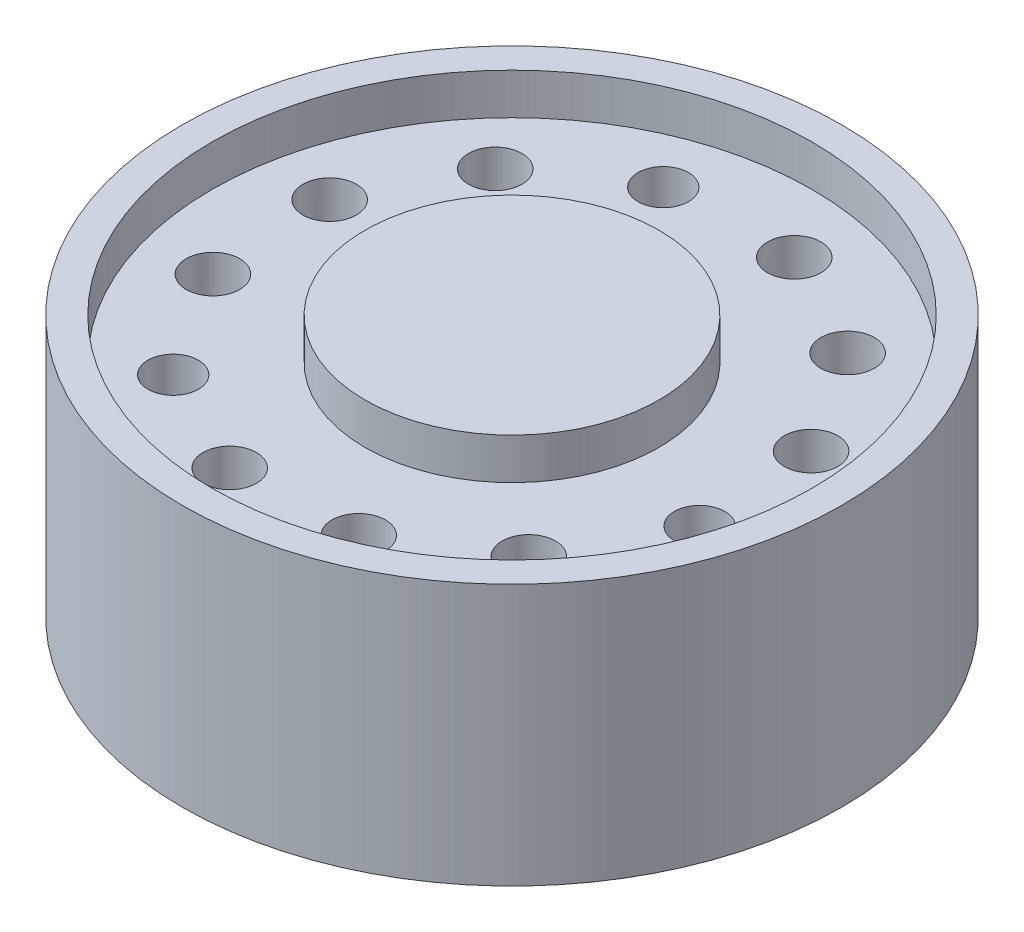
ISO-10303-21;
HEADER;
FILE_DESCRIPTION(('STEP AP214'),'2;1');
FILE_NAME('part.step','',(''),(''),'','','');
FILE_SCHEMA(('AUTOMOTIVE_DESIGN { 1 0 10303 214 1 1 1 1 }'));
ENDSEC;
DATA;
#1=APPLICATION_CONTEXT('core data for automotive mechanical design processes');
#2=APPLICATION_PROTOCOL_DEFINITION('international standard','automotive_design',2000,#1);
#3=PRODUCT_CONTEXT('',#1,'mechanical');
#4=PRODUCT('Part','Part','',(#3));
#5=PRODUCT_RELATED_PRODUCT_CATEGORY('part','',(#4));
#6=PRODUCT_DEFINITION_FORMATION('','',#4);
#7=PRODUCT_DEFINITION_CONTEXT('part definition',#1,'design');
#8=PRODUCT_DEFINITION('design','',#6,#7);
#9=PRODUCT_DEFINITION_SHAPE('','',#8);
#10=(LENGTH_UNIT() NAMED_UNIT(*) SI_UNIT(.MILLI.,.METRE.));
#11=(NAMED_UNIT(*) PLANE_ANGLE_UNIT() SI_UNIT($,.RADIAN.));
#12=(NAMED_UNIT(*) SI_UNIT($,.STERADIAN.) SOLID_ANGLE_UNIT());
#13=UNCERTAINTY_MEASURE_WITH_UNIT(LENGTH_MEASURE(1.E-05),#10,'distance_accuracy_value','');
#14=(GEOMETRIC_REPRESENTATION_CONTEXT(3) GLOBAL_UNCERTAINTY_ASSIGNED_CONTEXT((#13)) GLOBAL_UNIT_ASSIGNED_CONTEXT((#10,
#11,#12)) REPRESENTATION_CONTEXT('',''));
#15=CARTESIAN_POINT('',(0.,0.,0.));
#16=DIRECTION('',(0.,0.,1.));
#17=DIRECTION('',(1.,0.,0.));
#18=AXIS2_PLACEMENT_3D('',#15,#16,#17);
#19=CARTESIAN_POINT('',(0.,0.,0.));
#20=DIRECTION('',(0.,1.,0.));
#21=DIRECTION('',(0.,0.,1.));
#22=AXIS2_PLACEMENT_3D('',#19,#20,#21);
#23=PLANE('',#22);
#24=CARTESIAN_POINT('',(-12.8492820139193,0.,-38.3127139697356));
#25=DIRECTION('',(0.,-1.,0.));
#26=DIRECTION('',(0.,0.,-1.));
#27=AXIS2_PLACEMENT_3D('',#24,#25,#26);
#28=CIRCLE('',#27,4.24999999999999);
#29=CARTESIAN_POINT('',(-12.8492820139193,0.,-42.5627139697355));
#30=VERTEX_POINT('',#29);
#31=EDGE_CURVE('E665',#30,#30,#28,.T.);
#32=ORIENTED_EDGE('',*,*,#31,.F.);
#33=EDGE_LOOP('',(#32));
#34=FACE_BOUND('',#33,.T.);
#35=CARTESIAN_POINT('',(-8.40999001984254,0.,39.1059083498408));
#36=DIRECTION('',(0.,-1.,0.));
#37=DIRECTION('',(0.,0.,-1.));
#38=AXIS2_PLACEMENT_3D('',#35,#36,#37);
#39=CIRCLE('',#38,9.);
#40=CARTESIAN_POINT('',(-8.40999001984254,0.,30.1059083498408));
#41=VERTEX_POINT('',#40);
#42=EDGE_CURVE('E124',#41,#41,#39,.T.);
#43=ORIENTED_EDGE('',*,*,#42,.F.);
#44=EDGE_LOOP('',(#43));
#45=FACE_BOUND('',#44,.T.);
#46=CARTESIAN_POINT('',(29.6617150591073,0.,26.8362191776771));
#47=DIRECTION('',(0.,-1.,0.));
#48=DIRECTION('',(0.,0.,-1.));
#49=AXIS2_PLACEMENT_3D('',#46,#47,#48);
#50=CIRCLE('',#49,9.);
#51=CARTESIAN_POINT('',(29.6617150591073,0.,17.8362191776771));
#52=VERTEX_POINT('',#51);
#53=EDGE_CURVE('E137',#52,#52,#50,.T.);
#54=ORIENTED_EDGE('',*,*,#53,.F.);
#55=EDGE_LOOP('',(#54));
#56=FACE_BOUND('',#55,.T.);
#57=CARTESIAN_POINT('',(38.0717050789492,0.,-12.2696891721639));
#58=DIRECTION('',(0.,-1.,0.));
#59=DIRECTION('',(0.,0.,-1.));
#60=AXIS2_PLACEMENT_3D('',#57,#58,#59);
#61=CIRCLE('',#60,9.);
#62=CARTESIAN_POINT('',(38.0717050789492,0.,-21.2696891721639));
#63=VERTEX_POINT('',#62);
#64=EDGE_CURVE('E160',#63,#63,#61,.T.);
#65=ORIENTED_EDGE('',*,*,#64,.F.);
#66=EDGE_LOOP('',(#65));
#67=FACE_BOUND('',#66,.T.);
#68=CARTESIAN_POINT('',(26.8362191776771,0.,-29.6617150591074));
#69=DIRECTION('',(0.,-1.,0.));
#70=DIRECTION('',(0.,0.,-1.));
#71=AXIS2_PLACEMENT_3D('',#68,#69,#70);
#72=CIRCLE('',#71,9.);
#73=CARTESIAN_POINT('',(26.8362191776771,0.,-38.6617150591074));
#74=VERTEX_POINT('',#73);
#75=EDGE_CURVE('E169',#74,#74,#72,.T.);
#76=ORIENTED_EDGE('',*,*,#75,.F.);
#77=EDGE_LOOP('',(#76));
#78=FACE_BOUND('',#77,.T.);
#79=CARTESIAN_POINT('',(8.40999001984173,0.,-39.105908349841));
#80=DIRECTION('',(0.,-1.,0.));
#81=DIRECTION('',(0.,0.,-1.));
#82=AXIS2_PLACEMENT_3D('',#79,#80,#81);
#83=CIRCLE('',#82,9.);
#84=CARTESIAN_POINT('',(8.40999001984173,0.,-48.105908349841));
#85=VERTEX_POINT('',#84);
#86=EDGE_CURVE('E185',#85,#85,#83,.T.);
#87=ORIENTED_EDGE('',*,*,#86,.F.);
#88=EDGE_LOOP('',(#87));
#89=FACE_BOUND('',#88,.T.);
#90=CARTESIAN_POINT('',(-29.6617150591071,0.,-26.8362191776774));
#91=DIRECTION('',(0.,-1.,0.));
#92=DIRECTION('',(0.,0.,-1.));
#93=AXIS2_PLACEMENT_3D('',#90,#91,#92);
#94=CIRCLE('',#93,9.);
#95=CARTESIAN_POINT('',(-29.6617150591071,0.,-35.8362191776774));
#96=VERTEX_POINT('',#95);
#97=EDGE_CURVE('E199',#96,#96,#94,.T.);
#98=ORIENTED_EDGE('',*,*,#97,.F.);
#99=EDGE_LOOP('',(#98));
#100=FACE_BOUND('',#99,.T.);
#101=CARTESIAN_POINT('',(-39.1059083498409,0.,-8.40999001984212));
#102=DIRECTION('',(0.,-1.,0.));
#103=DIRECTION('',(0.,0.,-1.));
#104=AXIS2_PLACEMENT_3D('',#101,#102,#103);
#105=CIRCLE('',#104,9.);
#106=CARTESIAN_POINT('',(-39.1059083498409,0.,-17.4099900198421));
#107=VERTEX_POINT('',#106);
#108=EDGE_CURVE('E244',#107,#107,#105,.T.);
#109=ORIENTED_EDGE('',*,*,#108,.F.);
#110=EDGE_LOOP('',(#109));
#111=FACE_BOUND('',#110,.T.);
#112=CARTESIAN_POINT('',(-38.0717050789493,0.,12.2696891721636));
#113=DIRECTION('',(0.,-1.,0.));
#114=DIRECTION('',(0.,0.,-1.));
#115=AXIS2_PLACEMENT_3D('',#112,#113,#114);
#116=CIRCLE('',#115,9.);
#117=CARTESIAN_POINT('',(-38.0717050789493,0.,3.26968917216361));
#118=VERTEX_POINT('',#117);
#119=EDGE_CURVE('E248',#118,#118,#116,.T.);
#120=ORIENTED_EDGE('',*,*,#119,.F.);
#121=EDGE_LOOP('',(#120));
#122=FACE_BOUND('',#121,.T.);
#123=CARTESIAN_POINT('',(0.,0.,0.));
#124=DIRECTION('',(0.,1.,0.));
#125=DIRECTION('',(0.,0.,1.));
#126=AXIS2_PLACEMENT_3D('',#123,#124,#125);
#127=CIRCLE('',#126,55.5);
#128=CARTESIAN_POINT('',(0.,0.,55.5));
#129=VERTEX_POINT('',#128);
#130=EDGE_CURVE('E43',#129,#129,#127,.T.);
#131=ORIENTED_EDGE('',*,*,#130,.F.);
#132=EDGE_LOOP('',(#131));
#133=FACE_BOUND('',#132,.T.);
#134=CARTESIAN_POINT('',(12.2696891721637,0.,38.0717050789492));
#135=DIRECTION('',(0.,-1.,0.));
#136=DIRECTION('',(0.,0.,-1.));
#137=AXIS2_PLACEMENT_3D('',#134,#135,#136);
#138=CIRCLE('',#137,9.);
#139=CARTESIAN_POINT('',(12.2696891721637,0.,29.0717050789492));
#140=VERTEX_POINT('',#139);
#141=EDGE_CURVE('E99',#140,#140,#138,.T.);
#142=ORIENTED_EDGE('',*,*,#141,.F.);
#143=EDGE_LOOP('',(#142));
#144=FACE_BOUND('',#143,.T.);
#145=CARTESIAN_POINT('',(39.6044245926776,0.,8.02855234042326));
#146=DIRECTION('',(0.,-1.,0.));
#147=DIRECTION('',(0.,0.,-1.));
#148=AXIS2_PLACEMENT_3D('',#145,#146,#147);
#149=CIRCLE('',#148,4.24999999999999);
#150=CARTESIAN_POINT('',(39.6044245926776,0.,3.77855234042327));
#151=VERTEX_POINT('',#150);
#152=EDGE_CURVE('E87',#151,#151,#149,.T.);
#153=ORIENTED_EDGE('',*,*,#152,.F.);
#154=EDGE_LOOP('',(#153));
#155=FACE_BOUND('',#154,.T.);
#156=CARTESIAN_POINT('',(-26.7551425787583,0.,30.2841616293123));
#157=DIRECTION('',(0.,-1.,0.));
#158=DIRECTION('',(0.,0.,-1.));
#159=AXIS2_PLACEMENT_3D('',#156,#157,#158);
#160=CIRCLE('',#159,4.24999999999999);
#161=CARTESIAN_POINT('',(-26.7551425787583,0.,26.0341616293123));
#162=VERTEX_POINT('',#161);
#163=EDGE_CURVE('E88',#162,#162,#160,.T.);
#164=ORIENTED_EDGE('',*,*,#163,.F.);
#165=EDGE_LOOP('',(#164));
#166=FACE_BOUND('',#165,.T.);
#167=ADVANCED_FACE('F39',(#34,#45,#56,#67,#78,#89,#100,#111,#122,#133,#144,#155,#166),#23,.F.);
#168=CARTESIAN_POINT('',(0.,44.,0.));
#169=DIRECTION('',(0.,-1.,0.));
#170=DIRECTION('',(0.,0.,-1.));
#171=AXIS2_PLACEMENT_3D('',#168,#169,#170);
#172=CYLINDRICAL_SURFACE('',#171,55.5);
#173=CARTESIAN_POINT('',(0.,44.,0.));
#174=DIRECTION('',(0.,1.,0.));
#175=DIRECTION('',(0.,0.,1.));
#176=AXIS2_PLACEMENT_3D('',#173,#174,#175);
#177=CIRCLE('',#176,55.5);
#178=CARTESIAN_POINT('',(0.,44.,55.5));
#179=VERTEX_POINT('',#178);
#180=EDGE_CURVE('E11',#179,#179,#177,.T.);
#181=ORIENTED_EDGE('',*,*,#180,.F.);
#182=EDGE_LOOP('',(#181));
#183=FACE_BOUND('',#182,.T.);
#184=ORIENTED_EDGE('',*,*,#130,.T.);
#185=EDGE_LOOP('',(#184));
#186=FACE_BOUND('',#185,.T.);
#187=ADVANCED_FACE('F41',(#183,#186),#172,.T.);
#188=CARTESIAN_POINT('',(0.,44.,0.));
#189=DIRECTION('',(0.,1.,0.));
#190=DIRECTION('',(0.,0.,1.));
#191=AXIS2_PLACEMENT_3D('',#188,#189,#190);
#192=PLANE('',#191);
#193=CARTESIAN_POINT('',(0.,44.,0.));
#194=DIRECTION('',(0.,1.,0.));
#195=DIRECTION('',(0.,0.,1.));
#196=AXIS2_PLACEMENT_3D('',#193,#194,#195);
#197=CIRCLE('',#196,50.5);
#198=CARTESIAN_POINT('',(0.,44.,50.5));
#199=VERTEX_POINT('',#198);
#200=EDGE_CURVE('E54',#199,#199,#197,.T.);
#201=ORIENTED_EDGE('',*,*,#200,.F.);
#202=EDGE_LOOP('',(#201));
#203=FACE_BOUND('',#202,.T.);
#204=ORIENTED_EDGE('',*,*,#180,.T.);
#205=EDGE_LOOP('',(#204));
#206=FACE_BOUND('',#205,.T.);
#207=ADVANCED_FACE('F384',(#203,#206),#192,.T.);
#208=CARTESIAN_POINT('',(0.,37.07,0.));
#209=DIRECTION('',(0.,1.,0.));
#210=DIRECTION('',(0.,0.,1.));
#211=AXIS2_PLACEMENT_3D('',#208,#209,#210);
#212=CYLINDRICAL_SURFACE('',#211,24.75);
#213=CARTESIAN_POINT('',(0.,37.07,0.));
#214=DIRECTION('',(0.,1.,0.));
#215=DIRECTION('',(0.,0.,1.));
#216=AXIS2_PLACEMENT_3D('',#213,#214,#215);
#217=CIRCLE('',#216,24.75);
#218=CARTESIAN_POINT('',(0.,37.07,24.75));
#219=VERTEX_POINT('',#218);
#220=EDGE_CURVE('E66',#219,#219,#217,.T.);
#221=CARTESIAN_POINT('',(0.,44.,0.));
#222=DIRECTION('',(0.,1.,0.));
#223=DIRECTION('',(0.,0.,1.));
#224=AXIS2_PLACEMENT_3D('',#221,#222,#223);
#225=CIRCLE('',#224,24.75);
#226=CARTESIAN_POINT('',(0.,44.,24.75));
#227=VERTEX_POINT('',#226);
#228=EDGE_CURVE('E76',#227,#227,#225,.T.);
#229=CARTESIAN_POINT('',(0.,37.07,24.75));
#230=CARTESIAN_POINT('',(0.,37.1421875,24.75));
#231=CARTESIAN_POINT('',(0.,37.214375,24.75));
#232=CARTESIAN_POINT('',(0.,37.35875,24.75));
#233=CARTESIAN_POINT('',(0.,37.4309375,24.75));
#234=CARTESIAN_POINT('',(0.,37.5753125,24.75));
#235=CARTESIAN_POINT('',(0.,37.6475,24.75));
#236=CARTESIAN_POINT('',(0.,37.791875,24.75));
#237=CARTESIAN_POINT('',(0.,37.8640625,24.75));
#238=CARTESIAN_POINT('',(0.,38.0084375,24.75));
#239=CARTESIAN_POINT('',(0.,38.080625,24.75));
#240=CARTESIAN_POINT('',(0.,38.225,24.75));
#241=CARTESIAN_POINT('',(0.,38.2971875,24.75));
#242=CARTESIAN_POINT('',(0.,38.4415625,24.75));
#243=CARTESIAN_POINT('',(0.,38.51375,24.75));
#244=CARTESIAN_POINT('',(0.,38.658125,24.75));
#245=CARTESIAN_POINT('',(0.,38.7303125,24.75));
#246=CARTESIAN_POINT('',(0.,38.8746875,24.75));
#247=CARTESIAN_POINT('',(0.,38.946875,24.75));
#248=CARTESIAN_POINT('',(0.,39.09125,24.75));
#249=CARTESIAN_POINT('',(0.,39.1634375,24.75));
#250=CARTESIAN_POINT('',(0.,39.3078125,24.75));
#251=CARTESIAN_POINT('',(0.,39.38,24.75));
#252=CARTESIAN_POINT('',(0.,39.524375,24.75));
#253=CARTESIAN_POINT('',(0.,39.5965625,24.75));
#254=CARTESIAN_POINT('',(0.,39.7409375,24.75));
#255=CARTESIAN_POINT('',(0.,39.813125,24.75));
#256=CARTESIAN_POINT('',(0.,39.9575,24.75));
#257=CARTESIAN_POINT('',(0.,40.0296875,24.75));
#258=CARTESIAN_POINT('',(0.,40.1740625,24.75));
#259=CARTESIAN_POINT('',(0.,40.24625,24.75));
#260=CARTESIAN_POINT('',(0.,40.390625,24.75));
#261=CARTESIAN_POINT('',(0.,40.4628125,24.75));
#262=CARTESIAN_POINT('',(0.,40.6071875,24.75));
#263=CARTESIAN_POINT('',(0.,40.679375,24.75));
#264=CARTESIAN_POINT('',(0.,40.82375,24.75));
#265=CARTESIAN_POINT('',(0.,40.8959375,24.75));
#266=CARTESIAN_POINT('',(0.,41.0403125,24.75));
#267=CARTESIAN_POINT('',(0.,41.1125,24.75));
#268=CARTESIAN_POINT('',(0.,41.256875,24.75));
#269=CARTESIAN_POINT('',(0.,41.3290625,24.75));
#270=CARTESIAN_POINT('',(0.,41.4734375,24.75));
#271=CARTESIAN_POINT('',(0.,41.545625,24.75));
#272=CARTESIAN_POINT('',(0.,41.69,24.75));
#273=CARTESIAN_POINT('',(0.,41.7621875,24.75));
#274=CARTESIAN_POINT('',(0.,41.9065625,24.75));
#275=CARTESIAN_POINT('',(0.,41.97875,24.75));
#276=CARTESIAN_POINT('',(0.,42.123125,24.75));
#277=CARTESIAN_POINT('',(0.,42.1953125,24.75));
#278=CARTESIAN_POINT('',(0.,42.3396875,24.75));
#279=CARTESIAN_POINT('',(0.,42.411875,24.75));
#280=CARTESIAN_POINT('',(0.,42.55625,24.75));
#281=CARTESIAN_POINT('',(0.,42.6284375,24.75));
#282=CARTESIAN_POINT('',(0.,42.7728125,24.75));
#283=CARTESIAN_POINT('',(0.,42.845,24.75));
#284=CARTESIAN_POINT('',(0.,42.989375,24.75));
#285=CARTESIAN_POINT('',(0.,43.0615625,24.75));
#286=CARTESIAN_POINT('',(0.,43.2059375,24.75));
#287=CARTESIAN_POINT('',(0.,43.278125,24.75));
#288=CARTESIAN_POINT('',(0.,43.4225,24.75));
#289=CARTESIAN_POINT('',(0.,43.4946875,24.75));
#290=CARTESIAN_POINT('',(0.,43.6390625,24.75));
#291=CARTESIAN_POINT('',(0.,43.71125,24.75));
#292=CARTESIAN_POINT('',(0.,43.855625,24.75));
#293=CARTESIAN_POINT('',(0.,43.9278125,24.75));
#294=CARTESIAN_POINT('',(0.,44.,24.75));
#295=B_SPLINE_CURVE_WITH_KNOTS('',3,(#229,#230,#231,#232,#233,#234,#235,#236,#237,#238,#239,
#240,#241,#242,#243,#244,#245,#246,#247,#248,#249,#250,#251,#252,#253,#254,#255,#256,#257,#258,
#259,#260,#261,#262,#263,#264,#265,#266,#267,#268,#269,#270,#271,#272,#273,#274,#275,#276,#277,
#278,#279,#280,#281,#282,#283,#284,#285,#286,#287,#288,#289,#290,#291,#292,#293,#294),
.UNSPECIFIED.,.F.,.F.,(4,2,2,2,2,2,2,2,2,2,2,2,2,2,2,2,2,2,2,2,2,2,2,2,2,2,2,2,2,2,2,2,4),(0.,
0.216562499999996,0.433124999999999,0.649687499999996,0.866249999999999,1.0828125,1.299375,
1.51593749999999,1.7325,1.94906249999999,2.165625,2.38218749999999,2.59875,2.81531249999999,
3.031875,3.24843749999999,3.465,3.68156249999999,3.898125,4.1146875,4.33124999999999,
4.54781249999999,4.76437499999999,4.9809375,5.19749999999999,5.4140625,5.63062499999999,
5.8471875,6.06374999999999,6.2803125,6.49687499999999,6.7134375,6.92999999999999),.UNSPECIFIED.);
#296=EDGE_CURVE('BSEAM310',#219,#227,#295,.T.);
#297=ORIENTED_EDGE('',*,*,#220,.T.);
#298=ORIENTED_EDGE('',*,*,#228,.F.);
#299=ORIENTED_EDGE('',*,*,#296,.T.);
#300=ORIENTED_EDGE('',*,*,#296,.F.);
#301=EDGE_LOOP('',(#297,#299,#298,#300));
#302=FACE_BOUND('',#301,.T.);
#303=ADVANCED_FACE('F310',(#302),#212,.T.);
#304=CARTESIAN_POINT('',(0.,37.07,0.));
#305=DIRECTION('',(0.,1.,0.));
#306=DIRECTION('',(0.,0.,1.));
#307=AXIS2_PLACEMENT_3D('',#304,#305,#306);
#308=CYLINDRICAL_SURFACE('',#307,50.5);
#309=CARTESIAN_POINT('',(0.,37.07,0.));
#310=DIRECTION('',(0.,1.,0.));
#311=DIRECTION('',(0.,0.,1.));
#312=AXIS2_PLACEMENT_3D('',#309,#310,#311);
#313=CIRCLE('',#312,50.5);
#314=CARTESIAN_POINT('',(0.,37.07,50.5));
#315=VERTEX_POINT('',#314);
#316=EDGE_CURVE('E51',#315,#315,#313,.T.);
#317=CARTESIAN_POINT('',(0.,37.07,50.5));
#318=CARTESIAN_POINT('',(0.,37.1421875,50.5));
#319=CARTESIAN_POINT('',(0.,37.214375,50.5));
#320=CARTESIAN_POINT('',(0.,37.35875,50.5));
#321=CARTESIAN_POINT('',(0.,37.4309375,50.5));
#322=CARTESIAN_POINT('',(0.,37.5753125,50.5));
#323=CARTESIAN_POINT('',(0.,37.6475,50.5));
#324=CARTESIAN_POINT('',(0.,37.791875,50.5));
#325=CARTESIAN_POINT('',(0.,37.8640625,50.5));
#326=CARTESIAN_POINT('',(0.,38.0084375,50.5));
#327=CARTESIAN_POINT('',(0.,38.080625,50.5));
#328=CARTESIAN_POINT('',(0.,38.225,50.5));
#329=CARTESIAN_POINT('',(0.,38.2971875,50.5));
#330=CARTESIAN_POINT('',(0.,38.4415625,50.5));
#331=CARTESIAN_POINT('',(0.,38.51375,50.5));
#332=CARTESIAN_POINT('',(0.,38.658125,50.5));
#333=CARTESIAN_POINT('',(0.,38.7303125,50.5));
#334=CARTESIAN_POINT('',(0.,38.8746875,50.5));
#335=CARTESIAN_POINT('',(0.,38.946875,50.5));
#336=CARTESIAN_POINT('',(0.,39.09125,50.5));
#337=CARTESIAN_POINT('',(0.,39.1634375,50.5));
#338=CARTESIAN_POINT('',(0.,39.3078125,50.5));
#339=CARTESIAN_POINT('',(0.,39.38,50.5));
#340=CARTESIAN_POINT('',(0.,39.524375,50.5));
#341=CARTESIAN_POINT('',(0.,39.5965625,50.5));
#342=CARTESIAN_POINT('',(0.,39.7409375,50.5));
#343=CARTESIAN_POINT('',(0.,39.813125,50.5));
#344=CARTESIAN_POINT('',(0.,39.9575,50.5));
#345=CARTESIAN_POINT('',(0.,40.0296875,50.5));
#346=CARTESIAN_POINT('',(0.,40.1740625,50.5));
#347=CARTESIAN_POINT('',(0.,40.24625,50.5));
#348=CARTESIAN_POINT('',(0.,40.390625,50.5));
#349=CARTESIAN_POINT('',(0.,40.4628125,50.5));
#350=CARTESIAN_POINT('',(0.,40.6071875,50.5));
#351=CARTESIAN_POINT('',(0.,40.679375,50.5));
#352=CARTESIAN_POINT('',(0.,40.82375,50.5));
#353=CARTESIAN_POINT('',(0.,40.8959375,50.5));
#354=CARTESIAN_POINT('',(0.,41.0403125,50.5));
#355=CARTESIAN_POINT('',(0.,41.1125,50.5));
#356=CARTESIAN_POINT('',(0.,41.256875,50.5));
#357=CARTESIAN_POINT('',(0.,41.3290625,50.5));
#358=CARTESIAN_POINT('',(0.,41.4734375,50.5));
#359=CARTESIAN_POINT('',(0.,41.545625,50.5));
#360=CARTESIAN_POINT('',(0.,41.69,50.5));
#361=CARTESIAN_POINT('',(0.,41.7621875,50.5));
#362=CARTESIAN_POINT('',(0.,41.9065625,50.5));
#363=CARTESIAN_POINT('',(0.,41.97875,50.5));
#364=CARTESIAN_POINT('',(0.,42.123125,50.5));
#365=CARTESIAN_POINT('',(0.,42.1953125,50.5));
#366=CARTESIAN_POINT('',(0.,42.3396875,50.5));
#367=CARTESIAN_POINT('',(0.,42.411875,50.5));
#368=CARTESIAN_POINT('',(0.,42.55625,50.5));
#369=CARTESIAN_POINT('',(0.,42.6284375,50.5));
#370=CARTESIAN_POINT('',(0.,42.7728125,50.5));
#371=CARTESIAN_POINT('',(0.,42.845,50.5));
#372=CARTESIAN_POINT('',(0.,42.989375,50.5));
#373=CARTESIAN_POINT('',(0.,43.0615625,50.5));
#374=CARTESIAN_POINT('',(0.,43.2059375,50.5));
#375=CARTESIAN_POINT('',(0.,43.278125,50.5));
#376=CARTESIAN_POINT('',(0.,43.4225,50.5));
#377=CARTESIAN_POINT('',(0.,43.4946875,50.5));
#378=CARTESIAN_POINT('',(0.,43.6390625,50.5));
#379=CARTESIAN_POINT('',(0.,43.71125,50.5));
#380=CARTESIAN_POINT('',(0.,43.855625,50.5));
#381=CARTESIAN_POINT('',(0.,43.9278125,50.5));
#382=CARTESIAN_POINT('',(0.,44.,50.5));
#383=B_SPLINE_CURVE_WITH_KNOTS('',3,(#317,#318,#319,#320,#321,#322,#323,#324,#325,#326,#327,
#328,#329,#330,#331,#332,#333,#334,#335,#336,#337,#338,#339,#340,#341,#342,#343,#344,#345,#346,
#347,#348,#349,#350,#351,#352,#353,#354,#355,#356,#357,#358,#359,#360,#361,#362,#363,#364,#365,
#366,#367,#368,#369,#370,#371,#372,#373,#374,#375,#376,#377,#378,#379,#380,#381,#382),
.UNSPECIFIED.,.F.,.F.,(4,2,2,2,2,2,2,2,2,2,2,2,2,2,2,2,2,2,2,2,2,2,2,2,2,2,2,2,2,2,2,2,4),(0.,
0.216562499999996,0.433124999999999,0.649687499999996,0.866249999999999,1.0828125,1.299375,
1.51593749999999,1.7325,1.94906249999999,2.165625,2.38218749999999,2.59875,2.81531249999999,
3.031875,3.24843749999999,3.465,3.68156249999999,3.898125,4.1146875,4.33124999999999,
4.54781249999999,4.76437499999999,4.9809375,5.19749999999999,5.4140625,5.63062499999999,
5.8471875,6.06374999999999,6.2803125,6.49687499999999,6.7134375,6.92999999999999),.UNSPECIFIED.);
#384=EDGE_CURVE('BSEAM269',#315,#199,#383,.T.);
#385=ORIENTED_EDGE('',*,*,#316,.F.);
#386=ORIENTED_EDGE('',*,*,#200,.T.);
#387=ORIENTED_EDGE('',*,*,#384,.T.);
#388=ORIENTED_EDGE('',*,*,#384,.F.);
#389=EDGE_LOOP('',(#385,#387,#386,#388));
#390=FACE_BOUND('',#389,.T.);
#391=ADVANCED_FACE('F269',(#390),#308,.F.);
#392=CARTESIAN_POINT('',(0.,37.07,0.));
#393=DIRECTION('',(0.,1.,0.));
#394=DIRECTION('',(0.,0.,1.));
#395=AXIS2_PLACEMENT_3D('',#392,#393,#394);
#396=PLANE('',#395);
#397=CARTESIAN_POINT('',(-26.7551425787583,37.07,30.2841616293123));
#398=DIRECTION('',(0.,1.,0.));
#399=DIRECTION('',(0.,0.,1.));
#400=AXIS2_PLACEMENT_3D('',#397,#398,#399);
#401=CIRCLE('',#400,4.24999999999999);
#402=CARTESIAN_POINT('',(-26.7551425787583,37.07,34.5341616293123));
#403=VERTEX_POINT('',#402);
#404=EDGE_CURVE('E83',#403,#403,#401,.T.);
#405=ORIENTED_EDGE('',*,*,#404,.F.);
#406=EDGE_LOOP('',(#405));
#407=FACE_BOUND('',#406,.T.);
#408=CARTESIAN_POINT('',(39.6044245926776,37.07,8.02855234042326));
#409=DIRECTION('',(0.,1.,0.));
#410=DIRECTION('',(0.,0.,1.));
#411=AXIS2_PLACEMENT_3D('',#408,#409,#410);
#412=CIRCLE('',#411,4.24999999999999);
#413=CARTESIAN_POINT('',(39.6044245926776,37.07,12.2785523404232));
#414=VERTEX_POINT('',#413);
#415=EDGE_CURVE('E92',#414,#414,#412,.T.);
#416=ORIENTED_EDGE('',*,*,#415,.F.);
#417=EDGE_LOOP('',(#416));
#418=FACE_BOUND('',#417,.T.);
#419=CARTESIAN_POINT('',(-12.8492820139193,37.07,-38.3127139697356));
#420=DIRECTION('',(0.,1.,0.));
#421=DIRECTION('',(0.,0.,1.));
#422=AXIS2_PLACEMENT_3D('',#419,#420,#421);
#423=CIRCLE('',#422,4.24999999999999);
#424=CARTESIAN_POINT('',(-12.8492820139193,37.07,-34.0627139697356));
#425=VERTEX_POINT('',#424);
#426=EDGE_CURVE('E128',#425,#425,#423,.T.);
#427=ORIENTED_EDGE('',*,*,#426,.F.);
#428=EDGE_LOOP('',(#427));
#429=FACE_BOUND('',#428,.T.);
#430=CARTESIAN_POINT('',(-8.40999001984254,37.07,39.1059083498408));
#431=DIRECTION('',(0.,1.,0.));
#432=DIRECTION('',(0.,0.,1.));
#433=AXIS2_PLACEMENT_3D('',#430,#431,#432);
#434=CIRCLE('',#433,4.49999999999999);
#435=CARTESIAN_POINT('',(-8.40999001984254,37.07,43.6059083498408));
#436=VERTEX_POINT('',#435);
#437=EDGE_CURVE('E105',#436,#436,#434,.T.);
#438=ORIENTED_EDGE('',*,*,#437,.F.);
#439=EDGE_LOOP('',(#438));
#440=FACE_BOUND('',#439,.T.);
#441=CARTESIAN_POINT('',(12.2696891721637,37.07,38.0717050789492));
#442=DIRECTION('',(0.,1.,0.));
#443=DIRECTION('',(0.,0.,1.));
#444=AXIS2_PLACEMENT_3D('',#441,#442,#443);
#445=CIRCLE('',#444,4.49999999999999);
#446=CARTESIAN_POINT('',(12.2696891721637,37.07,42.5717050789492));
#447=VERTEX_POINT('',#446);
#448=EDGE_CURVE('E142',#447,#447,#445,.T.);
#449=ORIENTED_EDGE('',*,*,#448,.F.);
#450=EDGE_LOOP('',(#449));
#451=FACE_BOUND('',#450,.T.);
#452=CARTESIAN_POINT('',(29.6617150591073,37.07,26.8362191776771));
#453=DIRECTION('',(0.,1.,0.));
#454=DIRECTION('',(0.,0.,1.));
#455=AXIS2_PLACEMENT_3D('',#452,#453,#454);
#456=CIRCLE('',#455,4.49999999999999);
#457=CARTESIAN_POINT('',(29.6617150591073,37.07,31.3362191776771));
#458=VERTEX_POINT('',#457);
#459=EDGE_CURVE('E286',#458,#458,#456,.T.);
#460=ORIENTED_EDGE('',*,*,#459,.F.);
#461=EDGE_LOOP('',(#460));
#462=FACE_BOUND('',#461,.T.);
#463=CARTESIAN_POINT('',(38.0717050789492,37.07,-12.2696891721639));
#464=DIRECTION('',(0.,1.,0.));
#465=DIRECTION('',(0.,0.,1.));
#466=AXIS2_PLACEMENT_3D('',#463,#464,#465);
#467=CIRCLE('',#466,4.49999999999999);
#468=CARTESIAN_POINT('',(38.0717050789492,37.07,-7.76968917216388));
#469=VERTEX_POINT('',#468);
#470=EDGE_CURVE('E165',#469,#469,#467,.T.);
#471=ORIENTED_EDGE('',*,*,#470,.F.);
#472=EDGE_LOOP('',(#471));
#473=FACE_BOUND('',#472,.T.);
#474=CARTESIAN_POINT('',(26.8362191776771,37.07,-29.6617150591074));
#475=DIRECTION('',(0.,1.,0.));
#476=DIRECTION('',(0.,0.,1.));
#477=AXIS2_PLACEMENT_3D('',#474,#475,#476);
#478=CIRCLE('',#477,4.49999999999999);
#479=CARTESIAN_POINT('',(26.8362191776771,37.07,-25.1617150591074));
#480=VERTEX_POINT('',#479);
#481=EDGE_CURVE('E180',#480,#480,#478,.T.);
#482=ORIENTED_EDGE('',*,*,#481,.F.);
#483=EDGE_LOOP('',(#482));
#484=FACE_BOUND('',#483,.T.);
#485=CARTESIAN_POINT('',(8.40999001984173,37.07,-39.105908349841));
#486=DIRECTION('',(0.,1.,0.));
#487=DIRECTION('',(0.,0.,1.));
#488=AXIS2_PLACEMENT_3D('',#485,#486,#487);
#489=CIRCLE('',#488,4.49999999999999);
#490=CARTESIAN_POINT('',(8.40999001984173,37.07,-34.605908349841));
#491=VERTEX_POINT('',#490);
#492=EDGE_CURVE('E204',#491,#491,#489,.T.);
#493=ORIENTED_EDGE('',*,*,#492,.F.);
#494=EDGE_LOOP('',(#493));
#495=FACE_BOUND('',#494,.T.);
#496=CARTESIAN_POINT('',(-29.6617150591071,37.07,-26.8362191776774));
#497=DIRECTION('',(0.,1.,0.));
#498=DIRECTION('',(0.,0.,1.));
#499=AXIS2_PLACEMENT_3D('',#496,#497,#498);
#500=CIRCLE('',#499,4.49999999999999);
#501=CARTESIAN_POINT('',(-29.6617150591071,37.07,-22.3362191776774));
#502=VERTEX_POINT('',#501);
#503=EDGE_CURVE('E296',#502,#502,#500,.T.);
#504=ORIENTED_EDGE('',*,*,#503,.F.);
#505=EDGE_LOOP('',(#504));
#506=FACE_BOUND('',#505,.T.);
#507=CARTESIAN_POINT('',(-39.1059083498409,37.07,-8.40999001984212));
#508=DIRECTION('',(0.,1.,0.));
#509=DIRECTION('',(0.,0.,1.));
#510=AXIS2_PLACEMENT_3D('',#507,#508,#509);
#511=CIRCLE('',#510,4.49999999999999);
#512=CARTESIAN_POINT('',(-39.1059083498409,37.07,-3.90999001984213));
#513=VERTEX_POINT('',#512);
#514=EDGE_CURVE('E300',#513,#513,#511,.T.);
#515=ORIENTED_EDGE('',*,*,#514,.F.);
#516=EDGE_LOOP('',(#515));
#517=FACE_BOUND('',#516,.T.);
#518=CARTESIAN_POINT('',(-38.0717050789493,37.07,12.2696891721636));
#519=DIRECTION('',(0.,1.,0.));
#520=DIRECTION('',(0.,0.,1.));
#521=AXIS2_PLACEMENT_3D('',#518,#519,#520);
#522=CIRCLE('',#521,4.49999999999999);
#523=CARTESIAN_POINT('',(-38.0717050789493,37.07,16.7696891721636));
#524=VERTEX_POINT('',#523);
#525=EDGE_CURVE('E71',#524,#524,#522,.T.);
#526=ORIENTED_EDGE('',*,*,#525,.F.);
#527=EDGE_LOOP('',(#526));
#528=FACE_BOUND('',#527,.T.);
#529=ORIENTED_EDGE('',*,*,#220,.F.);
#530=EDGE_LOOP('',(#529));
#531=FACE_BOUND('',#530,.T.);
#532=ORIENTED_EDGE('',*,*,#316,.T.);
#533=EDGE_LOOP('',(#532));
#534=FACE_BOUND('',#533,.T.);
#535=ADVANCED_FACE('F265',(#407,#418,#429,#440,#451,#462,#473,#484,#495,#506,#517,#528,#531,
#534),#396,.T.);
#536=ORIENTED_EDGE('',*,*,#228,.T.);
#537=EDGE_LOOP('',(#536));
#538=FACE_BOUND('',#537,.T.);
#539=ADVANCED_FACE('F268',(#538),#192,.T.);
#540=CARTESIAN_POINT('',(-38.0717050789493,0.,12.2696891721636));
#541=DIRECTION('',(0.,-1.,0.));
#542=DIRECTION('',(0.,0.,-1.));
#543=AXIS2_PLACEMENT_3D('',#540,#541,#542);
#544=CYLINDRICAL_SURFACE('',#543,4.49999999999999);
#545=CARTESIAN_POINT('',(-38.0717050789493,30.,12.2696891721636));
#546=DIRECTION('',(0.,-1.,0.));
#547=DIRECTION('',(0.,0.,-1.));
#548=AXIS2_PLACEMENT_3D('',#545,#546,#547);
#549=CIRCLE('',#548,4.5);
#550=CARTESIAN_POINT('',(-38.0717050789493,30.,7.76968917216361));
#551=VERTEX_POINT('',#550);
#552=EDGE_CURVE('E318',#551,#551,#549,.T.);
#553=ORIENTED_EDGE('',*,*,#552,.T.);
#554=EDGE_LOOP('',(#553));
#555=FACE_BOUND('',#554,.T.);
#556=ORIENTED_EDGE('',*,*,#525,.T.);
#557=EDGE_LOOP('',(#556));
#558=FACE_BOUND('',#557,.T.);
#559=ADVANCED_FACE('F378',(#555,#558),#544,.F.);
#560=CARTESIAN_POINT('',(-33.5717050789493,30.,12.2696891721636));
#561=DIRECTION('',(0.,1.,0.));
#562=DIRECTION('',(0.,0.,1.));
#563=AXIS2_PLACEMENT_3D('',#560,#561,#562);
#564=PLANE('',#563);
#565=ORIENTED_EDGE('',*,*,#552,.F.);
#566=EDGE_LOOP('',(#565));
#567=FACE_BOUND('',#566,.T.);
#568=CARTESIAN_POINT('',(-38.0717050789493,30.,12.2696891721636));
#569=DIRECTION('',(0.,-1.,0.));
#570=DIRECTION('',(0.,0.,-1.));
#571=AXIS2_PLACEMENT_3D('',#568,#569,#570);
#572=CIRCLE('',#571,9.);
#573=CARTESIAN_POINT('',(-38.0717050789493,30.,3.26968917216361));
#574=VERTEX_POINT('',#573);
#575=EDGE_CURVE('E321',#574,#574,#572,.T.);
#576=ORIENTED_EDGE('',*,*,#575,.T.);
#577=EDGE_LOOP('',(#576));
#578=FACE_BOUND('',#577,.T.);
#579=ADVANCED_FACE('F374',(#567,#578),#564,.F.);
#580=CARTESIAN_POINT('',(-38.0717050789493,0.,12.2696891721636));
#581=DIRECTION('',(0.,-1.,0.));
#582=DIRECTION('',(0.,0.,-1.));
#583=AXIS2_PLACEMENT_3D('',#580,#581,#582);
#584=CYLINDRICAL_SURFACE('',#583,9.);
#585=ORIENTED_EDGE('',*,*,#575,.F.);
#586=EDGE_LOOP('',(#585));
#587=FACE_BOUND('',#586,.T.);
#588=ORIENTED_EDGE('',*,*,#119,.T.);
#589=EDGE_LOOP('',(#588));
#590=FACE_BOUND('',#589,.T.);
#591=ADVANCED_FACE('F370',(#587,#590),#584,.F.);
#592=CARTESIAN_POINT('',(-39.1059083498409,0.,-8.40999001984212));
#593=DIRECTION('',(0.,-1.,0.));
#594=DIRECTION('',(0.,0.,-1.));
#595=AXIS2_PLACEMENT_3D('',#592,#593,#594);
#596=CYLINDRICAL_SURFACE('',#595,4.49999999999999);
#597=CARTESIAN_POINT('',(-39.1059083498409,30.,-8.40999001984212));
#598=DIRECTION('',(0.,-1.,0.));
#599=DIRECTION('',(0.,0.,-1.));
#600=AXIS2_PLACEMENT_3D('',#597,#598,#599);
#601=CIRCLE('',#600,4.5);
#602=CARTESIAN_POINT('',(-39.1059083498409,30.,-12.9099900198421));
#603=VERTEX_POINT('',#602);
#604=EDGE_CURVE('E336',#603,#603,#601,.T.);
#605=ORIENTED_EDGE('',*,*,#604,.T.);
#606=EDGE_LOOP('',(#605));
#607=FACE_BOUND('',#606,.T.);
#608=ORIENTED_EDGE('',*,*,#514,.T.);
#609=EDGE_LOOP('',(#608));
#610=FACE_BOUND('',#609,.T.);
#611=ADVANCED_FACE('F363',(#607,#610),#596,.F.);
#612=CARTESIAN_POINT('',(-34.6059083498409,30.,-8.40999001984212));
#613=DIRECTION('',(0.,1.,0.));
#614=DIRECTION('',(0.,0.,1.));
#615=AXIS2_PLACEMENT_3D('',#612,#613,#614);
#616=PLANE('',#615);
#617=ORIENTED_EDGE('',*,*,#604,.F.);
#618=EDGE_LOOP('',(#617));
#619=FACE_BOUND('',#618,.T.);
#620=CARTESIAN_POINT('',(-39.1059083498409,30.,-8.40999001984212));
#621=DIRECTION('',(0.,-1.,0.));
#622=DIRECTION('',(0.,0.,-1.));
#623=AXIS2_PLACEMENT_3D('',#620,#621,#622);
#624=CIRCLE('',#623,9.);
#625=CARTESIAN_POINT('',(-39.1059083498409,30.,-17.4099900198421));
#626=VERTEX_POINT('',#625);
#627=EDGE_CURVE('E340',#626,#626,#624,.T.);
#628=ORIENTED_EDGE('',*,*,#627,.T.);
#629=EDGE_LOOP('',(#628));
#630=FACE_BOUND('',#629,.T.);
#631=ADVANCED_FACE('F350',(#619,#630),#616,.F.);
#632=CARTESIAN_POINT('',(-39.1059083498409,0.,-8.40999001984212));
#633=DIRECTION('',(0.,-1.,0.));
#634=DIRECTION('',(0.,0.,-1.));
#635=AXIS2_PLACEMENT_3D('',#632,#633,#634);
#636=CYLINDRICAL_SURFACE('',#635,9.);
#637=ORIENTED_EDGE('',*,*,#627,.F.);
#638=EDGE_LOOP('',(#637));
#639=FACE_BOUND('',#638,.T.);
#640=ORIENTED_EDGE('',*,*,#108,.T.);
#641=EDGE_LOOP('',(#640));
#642=FACE_BOUND('',#641,.T.);
#643=ADVANCED_FACE('F352',(#639,#642),#636,.F.);
#644=CARTESIAN_POINT('',(-29.6617150591071,0.,-26.8362191776774));
#645=DIRECTION('',(0.,-1.,0.));
#646=DIRECTION('',(0.,0.,-1.));
#647=AXIS2_PLACEMENT_3D('',#644,#645,#646);
#648=CYLINDRICAL_SURFACE('',#647,4.49999999999999);
#649=CARTESIAN_POINT('',(-29.6617150591071,30.,-26.8362191776774));
#650=DIRECTION('',(0.,-1.,0.));
#651=DIRECTION('',(0.,0.,-1.));
#652=AXIS2_PLACEMENT_3D('',#649,#650,#651);
#653=CIRCLE('',#652,4.49999999999999);
#654=CARTESIAN_POINT('',(-29.6617150591071,30.,-31.3362191776774));
#655=VERTEX_POINT('',#654);
#656=EDGE_CURVE('E209',#655,#655,#653,.T.);
#657=ORIENTED_EDGE('',*,*,#656,.T.);
#658=EDGE_LOOP('',(#657));
#659=FACE_BOUND('',#658,.T.);
#660=ORIENTED_EDGE('',*,*,#503,.T.);
#661=EDGE_LOOP('',(#660));
#662=FACE_BOUND('',#661,.T.);
#663=ADVANCED_FACE('F354',(#659,#662),#648,.F.);
#664=CARTESIAN_POINT('',(-25.1617150591071,30.,-26.8362191776774));
#665=DIRECTION('',(0.,1.,0.));
#666=DIRECTION('',(0.,0.,1.));
#667=AXIS2_PLACEMENT_3D('',#664,#665,#666);
#668=PLANE('',#667);
#669=ORIENTED_EDGE('',*,*,#656,.F.);
#670=EDGE_LOOP('',(#669));
#671=FACE_BOUND('',#670,.T.);
#672=CARTESIAN_POINT('',(-29.6617150591071,30.,-26.8362191776774));
#673=DIRECTION('',(0.,-1.,0.));
#674=DIRECTION('',(0.,0.,-1.));
#675=AXIS2_PLACEMENT_3D('',#672,#673,#674);
#676=CIRCLE('',#675,9.);
#677=CARTESIAN_POINT('',(-29.6617150591071,30.,-35.8362191776774));
#678=VERTEX_POINT('',#677);
#679=EDGE_CURVE('E203',#678,#678,#676,.T.);
#680=ORIENTED_EDGE('',*,*,#679,.T.);
#681=EDGE_LOOP('',(#680));
#682=FACE_BOUND('',#681,.T.);
#683=ADVANCED_FACE('F360',(#671,#682),#668,.F.);
#684=CARTESIAN_POINT('',(-29.6617150591071,0.,-26.8362191776774));
#685=DIRECTION('',(0.,-1.,0.));
#686=DIRECTION('',(0.,0.,-1.));
#687=AXIS2_PLACEMENT_3D('',#684,#685,#686);
#688=CYLINDRICAL_SURFACE('',#687,9.);
#689=ORIENTED_EDGE('',*,*,#679,.F.);
#690=EDGE_LOOP('',(#689));
#691=FACE_BOUND('',#690,.T.);
#692=ORIENTED_EDGE('',*,*,#97,.T.);
#693=EDGE_LOOP('',(#692));
#694=FACE_BOUND('',#693,.T.);
#695=ADVANCED_FACE('F436',(#691,#694),#688,.F.);
#696=CARTESIAN_POINT('',(8.40999001984173,0.,-39.105908349841));
#697=DIRECTION('',(0.,-1.,0.));
#698=DIRECTION('',(0.,0.,-1.));
#699=AXIS2_PLACEMENT_3D('',#696,#697,#698);
#700=CYLINDRICAL_SURFACE('',#699,4.49999999999999);
#701=CARTESIAN_POINT('',(8.40999001984173,30.,-39.105908349841));
#702=DIRECTION('',(0.,-1.,0.));
#703=DIRECTION('',(0.,0.,-1.));
#704=AXIS2_PLACEMENT_3D('',#701,#702,#703);
#705=CIRCLE('',#704,4.49999999999999);
#706=CARTESIAN_POINT('',(8.40999001984173,30.,-43.605908349841));
#707=VERTEX_POINT('',#706);
#708=EDGE_CURVE('E218',#707,#707,#705,.T.);
#709=ORIENTED_EDGE('',*,*,#708,.T.);
#710=EDGE_LOOP('',(#709));
#711=FACE_BOUND('',#710,.T.);
#712=ORIENTED_EDGE('',*,*,#492,.T.);
#713=EDGE_LOOP('',(#712));
#714=FACE_BOUND('',#713,.T.);
#715=ADVANCED_FACE('F445',(#711,#714),#700,.F.);
#716=CARTESIAN_POINT('',(12.9099900198417,30.,-39.105908349841));
#717=DIRECTION('',(0.,1.,0.));
#718=DIRECTION('',(0.,0.,1.));
#719=AXIS2_PLACEMENT_3D('',#716,#717,#718);
#720=PLANE('',#719);
#721=ORIENTED_EDGE('',*,*,#708,.F.);
#722=EDGE_LOOP('',(#721));
#723=FACE_BOUND('',#722,.T.);
#724=CARTESIAN_POINT('',(8.40999001984173,30.,-39.105908349841));
#725=DIRECTION('',(0.,-1.,0.));
#726=DIRECTION('',(0.,0.,-1.));
#727=AXIS2_PLACEMENT_3D('',#724,#725,#726);
#728=CIRCLE('',#727,9.);
#729=CARTESIAN_POINT('',(8.40999001984173,30.,-48.105908349841));
#730=VERTEX_POINT('',#729);
#731=EDGE_CURVE('E191',#730,#730,#728,.T.);
#732=ORIENTED_EDGE('',*,*,#731,.T.);
#733=EDGE_LOOP('',(#732));
#734=FACE_BOUND('',#733,.T.);
#735=ADVANCED_FACE('F227',(#723,#734),#720,.F.);
#736=CARTESIAN_POINT('',(8.40999001984173,0.,-39.105908349841));
#737=DIRECTION('',(0.,-1.,0.));
#738=DIRECTION('',(0.,0.,-1.));
#739=AXIS2_PLACEMENT_3D('',#736,#737,#738);
#740=CYLINDRICAL_SURFACE('',#739,9.);
#741=ORIENTED_EDGE('',*,*,#731,.F.);
#742=EDGE_LOOP('',(#741));
#743=FACE_BOUND('',#742,.T.);
#744=ORIENTED_EDGE('',*,*,#86,.T.);
#745=EDGE_LOOP('',(#744));
#746=FACE_BOUND('',#745,.T.);
#747=ADVANCED_FACE('F229',(#743,#746),#740,.F.);
#748=CARTESIAN_POINT('',(26.8362191776771,0.,-29.6617150591074));
#749=DIRECTION('',(0.,-1.,0.));
#750=DIRECTION('',(0.,0.,-1.));
#751=AXIS2_PLACEMENT_3D('',#748,#749,#750);
#752=CYLINDRICAL_SURFACE('',#751,4.49999999999999);
#753=CARTESIAN_POINT('',(26.8362191776771,30.,-29.6617150591074));
#754=DIRECTION('',(0.,-1.,0.));
#755=DIRECTION('',(0.,0.,-1.));
#756=AXIS2_PLACEMENT_3D('',#753,#754,#755);
#757=CIRCLE('',#756,4.49999999999999);
#758=CARTESIAN_POINT('',(26.8362191776771,30.,-34.1617150591074));
#759=VERTEX_POINT('',#758);
#760=EDGE_CURVE('E186',#759,#759,#757,.T.);
#761=ORIENTED_EDGE('',*,*,#760,.T.);
#762=EDGE_LOOP('',(#761));
#763=FACE_BOUND('',#762,.T.);
#764=ORIENTED_EDGE('',*,*,#481,.T.);
#765=EDGE_LOOP('',(#764));
#766=FACE_BOUND('',#765,.T.);
#767=ADVANCED_FACE('F232',(#763,#766),#752,.F.);
#768=CARTESIAN_POINT('',(31.3362191776771,30.,-29.6617150591074));
#769=DIRECTION('',(0.,1.,0.));
#770=DIRECTION('',(0.,0.,1.));
#771=AXIS2_PLACEMENT_3D('',#768,#769,#770);
#772=PLANE('',#771);
#773=ORIENTED_EDGE('',*,*,#760,.F.);
#774=EDGE_LOOP('',(#773));
#775=FACE_BOUND('',#774,.T.);
#776=CARTESIAN_POINT('',(26.8362191776771,30.,-29.6617150591074));
#777=DIRECTION('',(0.,-1.,0.));
#778=DIRECTION('',(0.,0.,-1.));
#779=AXIS2_PLACEMENT_3D('',#776,#777,#778);
#780=CIRCLE('',#779,9.);
#781=CARTESIAN_POINT('',(26.8362191776771,30.,-38.6617150591074));
#782=VERTEX_POINT('',#781);
#783=EDGE_CURVE('E681',#782,#782,#780,.T.);
#784=ORIENTED_EDGE('',*,*,#783,.T.);
#785=EDGE_LOOP('',(#784));
#786=FACE_BOUND('',#785,.T.);
#787=ADVANCED_FACE('F478',(#775,#786),#772,.F.);
#788=CARTESIAN_POINT('',(26.8362191776771,0.,-29.6617150591074));
#789=DIRECTION('',(0.,-1.,0.));
#790=DIRECTION('',(0.,0.,-1.));
#791=AXIS2_PLACEMENT_3D('',#788,#789,#790);
#792=CYLINDRICAL_SURFACE('',#791,9.);
#793=ORIENTED_EDGE('',*,*,#783,.F.);
#794=EDGE_LOOP('',(#793));
#795=FACE_BOUND('',#794,.T.);
#796=ORIENTED_EDGE('',*,*,#75,.T.);
#797=EDGE_LOOP('',(#796));
#798=FACE_BOUND('',#797,.T.);
#799=ADVANCED_FACE('F488',(#795,#798),#792,.F.);
#800=CARTESIAN_POINT('',(38.0717050789492,0.,-12.2696891721639));
#801=DIRECTION('',(0.,-1.,0.));
#802=DIRECTION('',(0.,0.,-1.));
#803=AXIS2_PLACEMENT_3D('',#800,#801,#802);
#804=CYLINDRICAL_SURFACE('',#803,4.49999999999999);
#805=CARTESIAN_POINT('',(38.0717050789492,30.,-12.2696891721639));
#806=DIRECTION('',(0.,-1.,0.));
#807=DIRECTION('',(0.,0.,-1.));
#808=AXIS2_PLACEMENT_3D('',#805,#806,#807);
#809=CIRCLE('',#808,4.5);
#810=CARTESIAN_POINT('',(38.0717050789492,30.,-16.7696891721639));
#811=VERTEX_POINT('',#810);
#812=EDGE_CURVE('E159',#811,#811,#809,.T.);
#813=ORIENTED_EDGE('',*,*,#812,.T.);
#814=EDGE_LOOP('',(#813));
#815=FACE_BOUND('',#814,.T.);
#816=ORIENTED_EDGE('',*,*,#470,.T.);
#817=EDGE_LOOP('',(#816));
#818=FACE_BOUND('',#817,.T.);
#819=ADVANCED_FACE('F498',(#815,#818),#804,.F.);
#820=CARTESIAN_POINT('',(42.5717050789492,30.,-12.2696891721639));
#821=DIRECTION('',(0.,1.,0.));
#822=DIRECTION('',(0.,0.,1.));
#823=AXIS2_PLACEMENT_3D('',#820,#821,#822);
#824=PLANE('',#823);
#825=ORIENTED_EDGE('',*,*,#812,.F.);
#826=EDGE_LOOP('',(#825));
#827=FACE_BOUND('',#826,.T.);
#828=CARTESIAN_POINT('',(38.0717050789492,30.,-12.2696891721639));
#829=DIRECTION('',(0.,-1.,0.));
#830=DIRECTION('',(0.,0.,-1.));
#831=AXIS2_PLACEMENT_3D('',#828,#829,#830);
#832=CIRCLE('',#831,9.);
#833=CARTESIAN_POINT('',(38.0717050789492,30.,-21.2696891721639));
#834=VERTEX_POINT('',#833);
#835=EDGE_CURVE('E156',#834,#834,#832,.T.);
#836=ORIENTED_EDGE('',*,*,#835,.T.);
#837=EDGE_LOOP('',(#836));
#838=FACE_BOUND('',#837,.T.);
#839=ADVANCED_FACE('F508',(#827,#838),#824,.F.);
#840=CARTESIAN_POINT('',(38.0717050789492,0.,-12.2696891721639));
#841=DIRECTION('',(0.,-1.,0.));
#842=DIRECTION('',(0.,0.,-1.));
#843=AXIS2_PLACEMENT_3D('',#840,#841,#842);
#844=CYLINDRICAL_SURFACE('',#843,9.);
#845=ORIENTED_EDGE('',*,*,#835,.F.);
#846=EDGE_LOOP('',(#845));
#847=FACE_BOUND('',#846,.T.);
#848=ORIENTED_EDGE('',*,*,#64,.T.);
#849=EDGE_LOOP('',(#848));
#850=FACE_BOUND('',#849,.T.);
#851=ADVANCED_FACE('F518',(#847,#850),#844,.F.);
#852=CARTESIAN_POINT('',(29.6617150591073,0.,26.8362191776771));
#853=DIRECTION('',(0.,-1.,0.));
#854=DIRECTION('',(0.,0.,-1.));
#855=AXIS2_PLACEMENT_3D('',#852,#853,#854);
#856=CYLINDRICAL_SURFACE('',#855,4.49999999999999);
#857=CARTESIAN_POINT('',(29.6617150591073,30.,26.8362191776771));
#858=DIRECTION('',(0.,-1.,0.));
#859=DIRECTION('',(0.,0.,-1.));
#860=AXIS2_PLACEMENT_3D('',#857,#858,#859);
#861=CIRCLE('',#860,4.49999999999999);
#862=CARTESIAN_POINT('',(29.6617150591073,30.,22.3362191776772));
#863=VERTEX_POINT('',#862);
#864=EDGE_CURVE('E147',#863,#863,#861,.T.);
#865=ORIENTED_EDGE('',*,*,#864,.T.);
#866=EDGE_LOOP('',(#865));
#867=FACE_BOUND('',#866,.T.);
#868=ORIENTED_EDGE('',*,*,#459,.T.);
#869=EDGE_LOOP('',(#868));
#870=FACE_BOUND('',#869,.T.);
#871=ADVANCED_FACE('F528',(#867,#870),#856,.F.);
#872=CARTESIAN_POINT('',(34.1617150591073,30.,26.8362191776771));
#873=DIRECTION('',(0.,1.,0.));
#874=DIRECTION('',(0.,0.,1.));
#875=AXIS2_PLACEMENT_3D('',#872,#873,#874);
#876=PLANE('',#875);
#877=ORIENTED_EDGE('',*,*,#864,.F.);
#878=EDGE_LOOP('',(#877));
#879=FACE_BOUND('',#878,.T.);
#880=CARTESIAN_POINT('',(29.6617150591073,30.,26.8362191776771));
#881=DIRECTION('',(0.,-1.,0.));
#882=DIRECTION('',(0.,0.,-1.));
#883=AXIS2_PLACEMENT_3D('',#880,#881,#882);
#884=CIRCLE('',#883,9.);
#885=CARTESIAN_POINT('',(29.6617150591073,30.,17.8362191776771));
#886=VERTEX_POINT('',#885);
#887=EDGE_CURVE('E141',#886,#886,#884,.T.);
#888=ORIENTED_EDGE('',*,*,#887,.T.);
#889=EDGE_LOOP('',(#888));
#890=FACE_BOUND('',#889,.T.);
#891=ADVANCED_FACE('F538',(#879,#890),#876,.F.);
#892=CARTESIAN_POINT('',(29.6617150591073,0.,26.8362191776771));
#893=DIRECTION('',(0.,-1.,0.));
#894=DIRECTION('',(0.,0.,-1.));
#895=AXIS2_PLACEMENT_3D('',#892,#893,#894);
#896=CYLINDRICAL_SURFACE('',#895,9.);
#897=ORIENTED_EDGE('',*,*,#887,.F.);
#898=EDGE_LOOP('',(#897));
#899=FACE_BOUND('',#898,.T.);
#900=ORIENTED_EDGE('',*,*,#53,.T.);
#901=EDGE_LOOP('',(#900));
#902=FACE_BOUND('',#901,.T.);
#903=ADVANCED_FACE('F548',(#899,#902),#896,.F.);
#904=CARTESIAN_POINT('',(12.2696891721637,0.,38.0717050789492));
#905=DIRECTION('',(0.,-1.,0.));
#906=DIRECTION('',(0.,0.,-1.));
#907=AXIS2_PLACEMENT_3D('',#904,#905,#906);
#908=CYLINDRICAL_SURFACE('',#907,4.49999999999999);
#909=CARTESIAN_POINT('',(12.2696891721637,30.,38.0717050789492));
#910=DIRECTION('',(0.,-1.,0.));
#911=DIRECTION('',(0.,0.,-1.));
#912=AXIS2_PLACEMENT_3D('',#909,#910,#911);
#913=CIRCLE('',#912,4.49999999999999);
#914=CARTESIAN_POINT('',(12.2696891721637,30.,33.5717050789492));
#915=VERTEX_POINT('',#914);
#916=EDGE_CURVE('E111',#915,#915,#913,.T.);
#917=ORIENTED_EDGE('',*,*,#916,.T.);
#918=EDGE_LOOP('',(#917));
#919=FACE_BOUND('',#918,.T.);
#920=ORIENTED_EDGE('',*,*,#448,.T.);
#921=EDGE_LOOP('',(#920));
#922=FACE_BOUND('',#921,.T.);
#923=ADVANCED_FACE('F558',(#919,#922),#908,.F.);
#924=CARTESIAN_POINT('',(16.7696891721637,30.,38.0717050789492));
#925=DIRECTION('',(0.,1.,0.));
#926=DIRECTION('',(0.,0.,1.));
#927=AXIS2_PLACEMENT_3D('',#924,#925,#926);
#928=PLANE('',#927);
#929=ORIENTED_EDGE('',*,*,#916,.F.);
#930=EDGE_LOOP('',(#929));
#931=FACE_BOUND('',#930,.T.);
#932=CARTESIAN_POINT('',(12.2696891721637,30.,38.0717050789492));
#933=DIRECTION('',(0.,-1.,0.));
#934=DIRECTION('',(0.,0.,-1.));
#935=AXIS2_PLACEMENT_3D('',#932,#933,#934);
#936=CIRCLE('',#935,9.);
#937=CARTESIAN_POINT('',(12.2696891721637,30.,29.0717050789492));
#938=VERTEX_POINT('',#937);
#939=EDGE_CURVE('E104',#938,#938,#936,.T.);
#940=ORIENTED_EDGE('',*,*,#939,.T.);
#941=EDGE_LOOP('',(#940));
#942=FACE_BOUND('',#941,.T.);
#943=ADVANCED_FACE('F568',(#931,#942),#928,.F.);
#944=CARTESIAN_POINT('',(12.2696891721637,0.,38.0717050789492));
#945=DIRECTION('',(0.,-1.,0.));
#946=DIRECTION('',(0.,0.,-1.));
#947=AXIS2_PLACEMENT_3D('',#944,#945,#946);
#948=CYLINDRICAL_SURFACE('',#947,9.);
#949=ORIENTED_EDGE('',*,*,#939,.F.);
#950=EDGE_LOOP('',(#949));
#951=FACE_BOUND('',#950,.T.);
#952=ORIENTED_EDGE('',*,*,#141,.T.);
#953=EDGE_LOOP('',(#952));
#954=FACE_BOUND('',#953,.T.);
#955=ADVANCED_FACE('F578',(#951,#954),#948,.F.);
#956=CARTESIAN_POINT('',(-8.40999001984254,0.,39.1059083498408));
#957=DIRECTION('',(0.,-1.,0.));
#958=DIRECTION('',(0.,0.,-1.));
#959=AXIS2_PLACEMENT_3D('',#956,#957,#958);
#960=CYLINDRICAL_SURFACE('',#959,4.49999999999999);
#961=CARTESIAN_POINT('',(-8.40999001984254,30.,39.1059083498408));
#962=DIRECTION('',(0.,-1.,0.));
#963=DIRECTION('',(0.,0.,-1.));
#964=AXIS2_PLACEMENT_3D('',#961,#962,#963);
#965=CIRCLE('',#964,4.49999999999999);
#966=CARTESIAN_POINT('',(-8.40999001984254,30.,34.6059083498408));
#967=VERTEX_POINT('',#966);
#968=EDGE_CURVE('E117',#967,#967,#965,.T.);
#969=ORIENTED_EDGE('',*,*,#968,.T.);
#970=EDGE_LOOP('',(#969));
#971=FACE_BOUND('',#970,.T.);
#972=ORIENTED_EDGE('',*,*,#437,.T.);
#973=EDGE_LOOP('',(#972));
#974=FACE_BOUND('',#973,.T.);
#975=ADVANCED_FACE('F588',(#971,#974),#960,.F.);
#976=CARTESIAN_POINT('',(-3.90999001984255,30.,39.1059083498408));
#977=DIRECTION('',(0.,1.,0.));
#978=DIRECTION('',(0.,0.,1.));
#979=AXIS2_PLACEMENT_3D('',#976,#977,#978);
#980=PLANE('',#979);
#981=ORIENTED_EDGE('',*,*,#968,.F.);
#982=EDGE_LOOP('',(#981));
#983=FACE_BOUND('',#982,.T.);
#984=CARTESIAN_POINT('',(-8.40999001984254,30.,39.1059083498408));
#985=DIRECTION('',(0.,-1.,0.));
#986=DIRECTION('',(0.,0.,-1.));
#987=AXIS2_PLACEMENT_3D('',#984,#985,#986);
#988=CIRCLE('',#987,9.);
#989=CARTESIAN_POINT('',(-8.40999001984254,30.,30.1059083498408));
#990=VERTEX_POINT('',#989);
#991=EDGE_CURVE('E120',#990,#990,#988,.T.);
#992=ORIENTED_EDGE('',*,*,#991,.T.);
#993=EDGE_LOOP('',(#992));
#994=FACE_BOUND('',#993,.T.);
#995=ADVANCED_FACE('F598',(#983,#994),#980,.F.);
#996=CARTESIAN_POINT('',(-8.40999001984254,0.,39.1059083498408));
#997=DIRECTION('',(0.,-1.,0.));
#998=DIRECTION('',(0.,0.,-1.));
#999=AXIS2_PLACEMENT_3D('',#996,#997,#998);
#1000=CYLINDRICAL_SURFACE('',#999,9.);
#1001=ORIENTED_EDGE('',*,*,#991,.F.);
#1002=EDGE_LOOP('',(#1001));
#1003=FACE_BOUND('',#1002,.T.);
#1004=ORIENTED_EDGE('',*,*,#42,.T.);
#1005=EDGE_LOOP('',(#1004));
#1006=FACE_BOUND('',#1005,.T.);
#1007=ADVANCED_FACE('F608',(#1003,#1006),#1000,.F.);
#1008=CARTESIAN_POINT('',(-12.8492820139193,0.,-38.3127139697356));
#1009=DIRECTION('',(0.,-1.,0.));
#1010=DIRECTION('',(0.,0.,-1.));
#1011=AXIS2_PLACEMENT_3D('',#1008,#1009,#1010);
#1012=CYLINDRICAL_SURFACE('',#1011,4.24999999999999);
#1013=ORIENTED_EDGE('',*,*,#31,.T.);
#1014=EDGE_LOOP('',(#1013));
#1015=FACE_BOUND('',#1014,.T.);
#1016=ORIENTED_EDGE('',*,*,#426,.T.);
#1017=EDGE_LOOP('',(#1016));
#1018=FACE_BOUND('',#1017,.T.);
#1019=ADVANCED_FACE('F618',(#1015,#1018),#1012,.F.);
#1020=CARTESIAN_POINT('',(39.6044245926776,0.,8.02855234042326));
#1021=DIRECTION('',(0.,-1.,0.));
#1022=DIRECTION('',(0.,0.,-1.));
#1023=AXIS2_PLACEMENT_3D('',#1020,#1021,#1022);
#1024=CYLINDRICAL_SURFACE('',#1023,4.24999999999999);
#1025=ORIENTED_EDGE('',*,*,#152,.T.);
#1026=EDGE_LOOP('',(#1025));
#1027=FACE_BOUND('',#1026,.T.);
#1028=ORIENTED_EDGE('',*,*,#415,.T.);
#1029=EDGE_LOOP('',(#1028));
#1030=FACE_BOUND('',#1029,.T.);
#1031=ADVANCED_FACE('F261',(#1027,#1030),#1024,.F.);
#1032=CARTESIAN_POINT('',(-26.7551425787583,0.,30.2841616293123));
#1033=DIRECTION('',(0.,-1.,0.));
#1034=DIRECTION('',(0.,0.,-1.));
#1035=AXIS2_PLACEMENT_3D('',#1032,#1033,#1034);
#1036=CYLINDRICAL_SURFACE('',#1035,4.24999999999999);
#1037=ORIENTED_EDGE('',*,*,#163,.T.);
#1038=EDGE_LOOP('',(#1037));
#1039=FACE_BOUND('',#1038,.T.);
#1040=ORIENTED_EDGE('',*,*,#404,.T.);
#1041=EDGE_LOOP('',(#1040));
#1042=FACE_BOUND('',#1041,.T.);
#1043=ADVANCED_FACE('F258',(#1039,#1042),#1036,.F.);
#1044=CLOSED_SHELL('',(#167,#187,#207,#303,#391,#535,#539,#559,#579,#591,#611,#631,#643,#663,
#683,#695,#715,#735,#747,#767,#787,#799,#819,#839,#851,#871,#891,#903,#923,#943,#955,#975,#995,
#1007,#1019,#1031,#1043));
#1045=MANIFOLD_SOLID_BREP('B2',#1044);
#1046=ADVANCED_BREP_SHAPE_REPRESENTATION('',(#18,#1045),#14);
#1047=SHAPE_DEFINITION_REPRESENTATION(#9,#1046);
ENDSEC;
END-ISO-10303-21;
